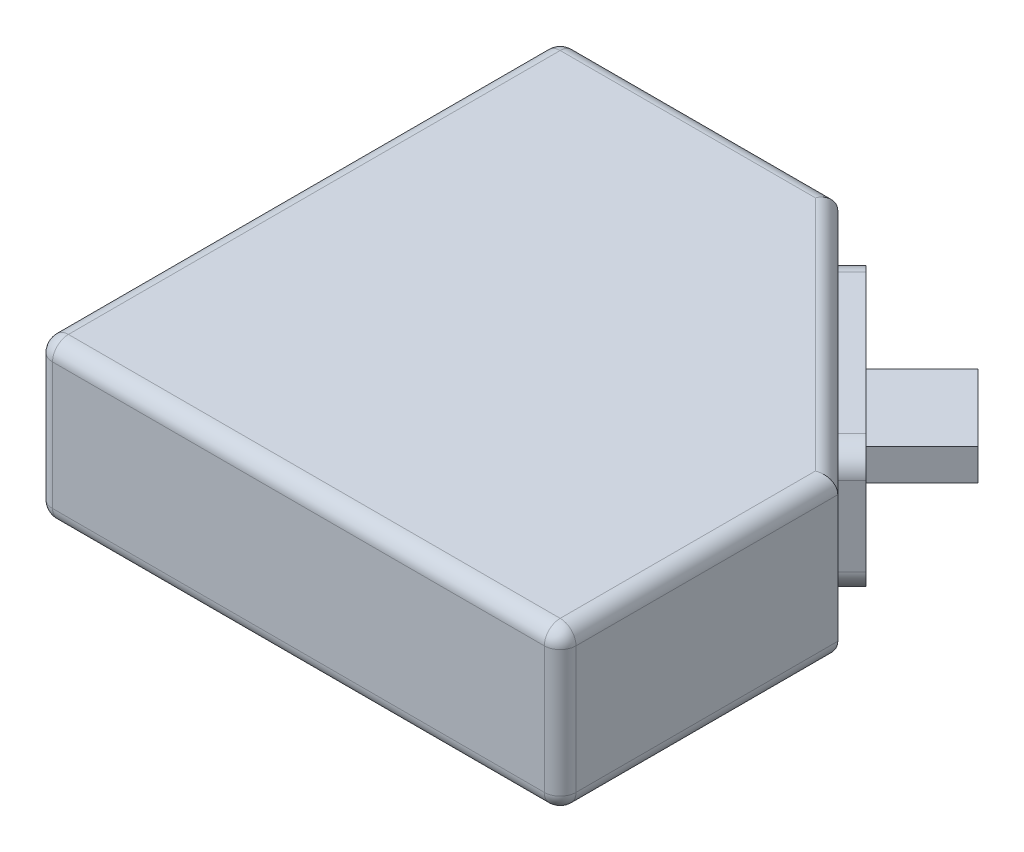
ISO-10303-21;
HEADER;
FILE_DESCRIPTION(('STEP AP214'),'2;1');
FILE_NAME('part.step','',(''),(''),'','','');
FILE_SCHEMA(('AUTOMOTIVE_DESIGN { 1 0 10303 214 1 1 1 1 }'));
ENDSEC;
DATA;
#1=APPLICATION_CONTEXT('core data for automotive mechanical design processes');
#2=APPLICATION_PROTOCOL_DEFINITION('international standard','automotive_design',2000,#1);
#3=PRODUCT_CONTEXT('',#1,'mechanical');
#4=PRODUCT('Part','Part','',(#3));
#5=PRODUCT_RELATED_PRODUCT_CATEGORY('part','',(#4));
#6=PRODUCT_DEFINITION_FORMATION('','',#4);
#7=PRODUCT_DEFINITION_CONTEXT('part definition',#1,'design');
#8=PRODUCT_DEFINITION('design','',#6,#7);
#9=PRODUCT_DEFINITION_SHAPE('','',#8);
#10=(LENGTH_UNIT() NAMED_UNIT(*) SI_UNIT(.MILLI.,.METRE.));
#11=(NAMED_UNIT(*) PLANE_ANGLE_UNIT() SI_UNIT($,.RADIAN.));
#12=(NAMED_UNIT(*) SI_UNIT($,.STERADIAN.) SOLID_ANGLE_UNIT());
#13=UNCERTAINTY_MEASURE_WITH_UNIT(LENGTH_MEASURE(1.E-05),#10,'distance_accuracy_value','');
#14=(GEOMETRIC_REPRESENTATION_CONTEXT(3) GLOBAL_UNCERTAINTY_ASSIGNED_CONTEXT((#13)) GLOBAL_UNIT_ASSIGNED_CONTEXT((#10,
#11,#12)) REPRESENTATION_CONTEXT('',''));
#15=CARTESIAN_POINT('',(0.,0.,0.));
#16=DIRECTION('',(0.,0.,1.));
#17=DIRECTION('',(1.,0.,0.));
#18=AXIS2_PLACEMENT_3D('',#15,#16,#17);
#19=CARTESIAN_POINT('',(35.,20.,-66.));
#20=DIRECTION('',(-0.707106781186548,0.,0.707106781186548));
#21=DIRECTION('',(0.707106781186548,0.,0.707106781186548));
#22=AXIS2_PLACEMENT_3D('',#19,#20,#21);
#23=PLANE('',#22);
#24=DIRECTION('',(0.,-1.,0.));
#25=VECTOR('',#24,1.);
#26=CARTESIAN_POINT('',(66.,20.,-35.));
#27=LINE('',#26,#25);
#28=CARTESIAN_POINT('',(66.,18.,-35.));
#29=VERTEX_POINT('',#28);
#30=CARTESIAN_POINT('',(66.,2.,-35.));
#31=VERTEX_POINT('',#30);
#32=EDGE_CURVE('E299',#29,#31,#27,.T.);
#33=ORIENTED_EDGE('',*,*,#32,.T.);
#34=DIRECTION('',(-0.707106781186548,0.,-0.707106781186548));
#35=VECTOR('',#34,1.);
#36=CARTESIAN_POINT('',(35.,2.,-66.));
#37=LINE('',#36,#35);
#38=CARTESIAN_POINT('',(59.3388347648318,1.99999999999999,-41.6611652351682));
#39=VERTEX_POINT('',#38);
#40=EDGE_CURVE('E335',#31,#39,#37,.T.);
#41=ORIENTED_EDGE('',*,*,#40,.T.);
#42=CARTESIAN_POINT('',(59.3388347648319,5.,-41.6611652351682));
#43=DIRECTION('',(0.707106781186548,0.,-0.707106781186547));
#44=DIRECTION('',(-0.707106781186547,0.,-0.707106781186548));
#45=AXIS2_PLACEMENT_3D('',#42,#43,#44);
#46=CIRCLE('',#45,3.);
#47=CARTESIAN_POINT('',(61.4601551083915,5.00000000000002,-39.5398448916085));
#48=VERTEX_POINT('',#47);
#49=EDGE_CURVE('E226',#48,#39,#46,.T.);
#50=ORIENTED_EDGE('',*,*,#49,.F.);
#51=DIRECTION('',(0.,-1.,0.));
#52=VECTOR('',#51,1.);
#53=CARTESIAN_POINT('',(61.4601551083915,15.,-39.5398448916085));
#54=LINE('',#53,#52);
#55=CARTESIAN_POINT('',(61.4601551083915,15.,-39.5398448916085));
#56=VERTEX_POINT('',#55);
#57=EDGE_CURVE('E239',#56,#48,#54,.T.);
#58=ORIENTED_EDGE('',*,*,#57,.F.);
#59=CARTESIAN_POINT('',(59.3388347648319,15.,-41.6611652351682));
#60=DIRECTION('',(0.707106781186548,0.,-0.707106781186547));
#61=DIRECTION('',(0.707106781186547,0.,0.707106781186548));
#62=AXIS2_PLACEMENT_3D('',#59,#60,#61);
#63=CIRCLE('',#62,3.);
#64=CARTESIAN_POINT('',(59.3388347648318,18.,-41.6611652351682));
#65=VERTEX_POINT('',#64);
#66=EDGE_CURVE('E268',#65,#56,#63,.T.);
#67=ORIENTED_EDGE('',*,*,#66,.F.);
#68=DIRECTION('',(-0.707106781186548,0.,-0.707106781186548));
#69=VECTOR('',#68,1.);
#70=CARTESIAN_POINT('',(35.,18.,-66.));
#71=LINE('',#70,#69);
#72=EDGE_CURVE('E329',#65,#29,#71,.F.);
#73=ORIENTED_EDGE('',*,*,#72,.T.);
#74=EDGE_LOOP('',(#33,#41,#50,#58,#67,#73));
#75=FACE_BOUND('',#74,.T.);
#76=ADVANCED_FACE('F35',(#75),#23,.F.);
#77=CARTESIAN_POINT('',(61.1066017177982,5.,-43.4289321881345));
#78=DIRECTION('',(0.707106781186548,0.,-0.707106781186547));
#79=DIRECTION('',(-0.707106781186547,0.,-0.707106781186548));
#80=AXIS2_PLACEMENT_3D('',#77,#78,#79);
#81=PLANE('',#80);
#82=CARTESIAN_POINT('',(61.1066017177982,5.,-43.4289321881345));
#83=DIRECTION('',(0.707106781186548,0.,-0.707106781186547));
#84=DIRECTION('',(-0.707106781186547,0.,-0.707106781186548));
#85=AXIS2_PLACEMENT_3D('',#82,#83,#84);
#86=CIRCLE('',#85,3.);
#87=CARTESIAN_POINT('',(63.2279220613579,5.00000000000002,-41.3076118445749));
#88=VERTEX_POINT('',#87);
#89=CARTESIAN_POINT('',(61.1066017177982,2.,-43.4289321881346));
#90=VERTEX_POINT('',#89);
#91=EDGE_CURVE('E235',#88,#90,#86,.T.);
#92=ORIENTED_EDGE('',*,*,#91,.T.);
#93=DIRECTION('',(-0.707106781186547,0.,-0.707106781186547));
#94=VECTOR('',#93,1.);
#95=CARTESIAN_POINT('',(43.4289321881346,2.,-61.1066017177982));
#96=LINE('',#95,#94);
#97=CARTESIAN_POINT('',(43.4289321881346,2.,-61.1066017177982));
#98=VERTEX_POINT('',#97);
#99=EDGE_CURVE('E238',#90,#98,#96,.T.);
#100=ORIENTED_EDGE('',*,*,#99,.T.);
#101=CARTESIAN_POINT('',(43.4289321881346,5.,-61.1066017177982));
#102=DIRECTION('',(0.707106781186548,0.,-0.707106781186547));
#103=DIRECTION('',(0.707106781186547,0.,0.707106781186548));
#104=AXIS2_PLACEMENT_3D('',#101,#102,#103);
#105=CIRCLE('',#104,3.);
#106=CARTESIAN_POINT('',(41.3076118445749,5.00000000000002,-63.2279220613579));
#107=VERTEX_POINT('',#106);
#108=EDGE_CURVE('E241',#98,#107,#105,.T.);
#109=ORIENTED_EDGE('',*,*,#108,.T.);
#110=DIRECTION('',(0.,1.,0.));
#111=VECTOR('',#110,1.);
#112=CARTESIAN_POINT('',(41.3076118445749,15.,-63.2279220613579));
#113=LINE('',#112,#111);
#114=CARTESIAN_POINT('',(41.3076118445749,15.,-63.2279220613579));
#115=VERTEX_POINT('',#114);
#116=EDGE_CURVE('E243',#107,#115,#113,.T.);
#117=ORIENTED_EDGE('',*,*,#116,.T.);
#118=CARTESIAN_POINT('',(43.4289321881346,15.,-61.1066017177982));
#119=DIRECTION('',(0.707106781186548,0.,-0.707106781186547));
#120=DIRECTION('',(0.707106781186547,0.,0.707106781186548));
#121=AXIS2_PLACEMENT_3D('',#118,#119,#120);
#122=CIRCLE('',#121,3.);
#123=CARTESIAN_POINT('',(43.4289321881346,18.,-61.1066017177982));
#124=VERTEX_POINT('',#123);
#125=EDGE_CURVE('E245',#115,#124,#122,.T.);
#126=ORIENTED_EDGE('',*,*,#125,.T.);
#127=DIRECTION('',(0.707106781186547,0.,0.707106781186547));
#128=VECTOR('',#127,1.);
#129=CARTESIAN_POINT('',(43.4289321881346,18.,-61.1066017177982));
#130=LINE('',#129,#128);
#131=CARTESIAN_POINT('',(61.1066017177982,18.,-43.4289321881346));
#132=VERTEX_POINT('',#131);
#133=EDGE_CURVE('E247',#124,#132,#130,.T.);
#134=ORIENTED_EDGE('',*,*,#133,.T.);
#135=CARTESIAN_POINT('',(61.1066017177982,15.,-43.4289321881345));
#136=DIRECTION('',(0.707106781186548,0.,-0.707106781186547));
#137=DIRECTION('',(0.707106781186547,0.,0.707106781186548));
#138=AXIS2_PLACEMENT_3D('',#135,#136,#137);
#139=CIRCLE('',#138,3.);
#140=CARTESIAN_POINT('',(63.2279220613579,15.,-41.3076118445749));
#141=VERTEX_POINT('',#140);
#142=EDGE_CURVE('E249',#132,#141,#139,.T.);
#143=ORIENTED_EDGE('',*,*,#142,.T.);
#144=DIRECTION('',(0.,-1.,0.));
#145=VECTOR('',#144,1.);
#146=CARTESIAN_POINT('',(63.2279220613579,15.,-41.3076118445749));
#147=LINE('',#146,#145);
#148=EDGE_CURVE('E251',#141,#88,#147,.T.);
#149=ORIENTED_EDGE('',*,*,#148,.T.);
#150=EDGE_LOOP('',(#92,#100,#109,#117,#126,#134,#143,#149));
#151=FACE_BOUND('',#150,.T.);
#152=DIRECTION('',(-0.707106781186548,0.,-0.707106781186548));
#153=VECTOR('',#152,1.);
#154=CARTESIAN_POINT('',(48.0251262658471,7.99999999999999,-56.5104076400857));
#155=LINE('',#154,#153);
#156=CARTESIAN_POINT('',(56.5104076400857,8.,-48.0251262658471));
#157=VERTEX_POINT('',#156);
#158=CARTESIAN_POINT('',(48.0251262658471,7.99999999999999,-56.5104076400857));
#159=VERTEX_POINT('',#158);
#160=EDGE_CURVE('E423',#157,#159,#155,.T.);
#161=ORIENTED_EDGE('',*,*,#160,.F.);
#162=DIRECTION('',(0.,-1.,0.));
#163=VECTOR('',#162,1.);
#164=CARTESIAN_POINT('',(56.5104076400857,12.,-48.0251262658471));
#165=LINE('',#164,#163);
#166=CARTESIAN_POINT('',(56.5104076400857,12.,-48.0251262658471));
#167=VERTEX_POINT('',#166);
#168=EDGE_CURVE('E224',#167,#157,#165,.T.);
#169=ORIENTED_EDGE('',*,*,#168,.F.);
#170=DIRECTION('',(0.707106781186548,0.,0.707106781186548));
#171=VECTOR('',#170,1.);
#172=CARTESIAN_POINT('',(48.0251262658471,12.,-56.5104076400857));
#173=LINE('',#172,#171);
#174=CARTESIAN_POINT('',(48.0251262658471,12.,-56.5104076400857));
#175=VERTEX_POINT('',#174);
#176=EDGE_CURVE('E220',#175,#167,#173,.T.);
#177=ORIENTED_EDGE('',*,*,#176,.F.);
#178=DIRECTION('',(0.,1.,0.));
#179=VECTOR('',#178,1.);
#180=CARTESIAN_POINT('',(48.0251262658471,12.,-56.5104076400857));
#181=LINE('',#180,#179);
#182=EDGE_CURVE('E425',#159,#175,#181,.T.);
#183=ORIENTED_EDGE('',*,*,#182,.F.);
#184=EDGE_LOOP('',(#161,#169,#177,#183));
#185=FACE_BOUND('',#184,.T.);
#186=ADVANCED_FACE('F442',(#151,#185),#81,.T.);
#187=CARTESIAN_POINT('',(41.6611652351682,5.,-59.3388347648319));
#188=DIRECTION('',(0.707106781186548,0.,-0.707106781186547));
#189=DIRECTION('',(0.707106781186547,0.,0.707106781186548));
#190=AXIS2_PLACEMENT_3D('',#187,#188,#189);
#191=CIRCLE('',#190,3.);
#192=CARTESIAN_POINT('',(41.6611652351682,2.,-59.3388347648318));
#193=VERTEX_POINT('',#192);
#194=CARTESIAN_POINT('',(39.5398448916085,5.00000000000002,-61.4601551083915));
#195=VERTEX_POINT('',#194);
#196=EDGE_CURVE('E256',#193,#195,#191,.T.);
#197=ORIENTED_EDGE('',*,*,#196,.F.);
#198=DIRECTION('',(-0.707106781186548,0.,-0.707106781186548));
#199=VECTOR('',#198,1.);
#200=CARTESIAN_POINT('',(35.,2.,-66.));
#201=LINE('',#200,#199);
#202=CARTESIAN_POINT('',(35.,2.,-66.));
#203=VERTEX_POINT('',#202);
#204=EDGE_CURVE('E333',#193,#203,#201,.T.);
#205=ORIENTED_EDGE('',*,*,#204,.T.);
#206=DIRECTION('',(0.,-1.,0.));
#207=VECTOR('',#206,1.);
#208=CARTESIAN_POINT('',(35.,20.,-66.));
#209=LINE('',#208,#207);
#210=CARTESIAN_POINT('',(35.,18.,-66.));
#211=VERTEX_POINT('',#210);
#212=EDGE_CURVE('E296',#211,#203,#209,.T.);
#213=ORIENTED_EDGE('',*,*,#212,.F.);
#214=DIRECTION('',(-0.707106781186548,0.,-0.707106781186548));
#215=VECTOR('',#214,1.);
#216=CARTESIAN_POINT('',(35.,18.,-66.));
#217=LINE('',#216,#215);
#218=CARTESIAN_POINT('',(41.6611652351682,18.,-59.3388347648318));
#219=VERTEX_POINT('',#218);
#220=EDGE_CURVE('E331',#211,#219,#217,.F.);
#221=ORIENTED_EDGE('',*,*,#220,.T.);
#222=CARTESIAN_POINT('',(41.6611652351682,15.,-59.3388347648319));
#223=DIRECTION('',(0.707106781186548,0.,-0.707106781186547));
#224=DIRECTION('',(0.707106781186547,0.,0.707106781186548));
#225=AXIS2_PLACEMENT_3D('',#222,#223,#224);
#226=CIRCLE('',#225,3.);
#227=CARTESIAN_POINT('',(39.5398448916085,15.,-61.4601551083915));
#228=VERTEX_POINT('',#227);
#229=EDGE_CURVE('E262',#228,#219,#226,.T.);
#230=ORIENTED_EDGE('',*,*,#229,.F.);
#231=DIRECTION('',(0.,1.,0.));
#232=VECTOR('',#231,1.);
#233=CARTESIAN_POINT('',(39.5398448916085,15.,-61.4601551083915));
#234=LINE('',#233,#232);
#235=EDGE_CURVE('E259',#195,#228,#234,.T.);
#236=ORIENTED_EDGE('',*,*,#235,.F.);
#237=EDGE_LOOP('',(#197,#205,#213,#221,#230,#236));
#238=FACE_BOUND('',#237,.T.);
#239=ADVANCED_FACE('F444',(#238),#23,.F.);
#240=CARTESIAN_POINT('',(0.,20.,0.));
#241=DIRECTION('',(1.,0.,0.));
#242=DIRECTION('',(0.,0.,-1.));
#243=AXIS2_PLACEMENT_3D('',#240,#241,#242);
#244=PLANE('',#243);
#245=DIRECTION('',(0.,0.,1.));
#246=VECTOR('',#245,1.);
#247=CARTESIAN_POINT('',(0.,18.,0.));
#248=LINE('',#247,#246);
#249=CARTESIAN_POINT('',(0.,18.,-2.));
#250=VERTEX_POINT('',#249);
#251=CARTESIAN_POINT('',(0.,18.,-64.));
#252=VERTEX_POINT('',#251);
#253=EDGE_CURVE('E345',#250,#252,#248,.F.);
#254=ORIENTED_EDGE('',*,*,#253,.T.);
#255=DIRECTION('',(0.,-1.,0.));
#256=VECTOR('',#255,1.);
#257=CARTESIAN_POINT('',(0.,20.,-64.));
#258=LINE('',#257,#256);
#259=CARTESIAN_POINT('',(0.,2.,-64.));
#260=VERTEX_POINT('',#259);
#261=EDGE_CURVE('E350',#252,#260,#258,.T.);
#262=ORIENTED_EDGE('',*,*,#261,.T.);
#263=DIRECTION('',(0.,0.,1.));
#264=VECTOR('',#263,1.);
#265=CARTESIAN_POINT('',(0.,2.,0.));
#266=LINE('',#265,#264);
#267=CARTESIAN_POINT('',(0.,2.,-2.));
#268=VERTEX_POINT('',#267);
#269=EDGE_CURVE('E347',#260,#268,#266,.T.);
#270=ORIENTED_EDGE('',*,*,#269,.T.);
#271=DIRECTION('',(0.,-1.,0.));
#272=VECTOR('',#271,1.);
#273=CARTESIAN_POINT('',(0.,20.,-2.));
#274=LINE('',#273,#272);
#275=EDGE_CURVE('E343',#268,#250,#274,.F.);
#276=ORIENTED_EDGE('',*,*,#275,.T.);
#277=EDGE_LOOP('',(#254,#262,#270,#276));
#278=FACE_BOUND('',#277,.T.);
#279=ADVANCED_FACE('F451',(#278),#244,.F.);
#280=CARTESIAN_POINT('',(0.,20.,0.));
#281=DIRECTION('',(0.,0.,-1.));
#282=DIRECTION('',(-1.,0.,0.));
#283=AXIS2_PLACEMENT_3D('',#280,#281,#282);
#284=PLANE('',#283);
#285=DIRECTION('',(1.,0.,0.));
#286=VECTOR('',#285,1.);
#287=CARTESIAN_POINT('',(66.,2.,0.));
#288=LINE('',#287,#286);
#289=CARTESIAN_POINT('',(2.,2.,0.));
#290=VERTEX_POINT('',#289);
#291=CARTESIAN_POINT('',(64.,2.,0.));
#292=VERTEX_POINT('',#291);
#293=EDGE_CURVE('E306',#290,#292,#288,.T.);
#294=ORIENTED_EDGE('',*,*,#293,.T.);
#295=DIRECTION('',(0.,-1.,0.));
#296=VECTOR('',#295,1.);
#297=CARTESIAN_POINT('',(64.,20.,0.));
#298=LINE('',#297,#296);
#299=CARTESIAN_POINT('',(64.,18.,0.));
#300=VERTEX_POINT('',#299);
#301=EDGE_CURVE('E309',#292,#300,#298,.F.);
#302=ORIENTED_EDGE('',*,*,#301,.T.);
#303=DIRECTION('',(1.,0.,0.));
#304=VECTOR('',#303,1.);
#305=CARTESIAN_POINT('',(0.,18.,0.));
#306=LINE('',#305,#304);
#307=CARTESIAN_POINT('',(2.,18.,0.));
#308=VERTEX_POINT('',#307);
#309=EDGE_CURVE('E304',#300,#308,#306,.F.);
#310=ORIENTED_EDGE('',*,*,#309,.T.);
#311=DIRECTION('',(0.,-1.,0.));
#312=VECTOR('',#311,1.);
#313=CARTESIAN_POINT('',(2.,20.,0.));
#314=LINE('',#313,#312);
#315=EDGE_CURVE('E302',#308,#290,#314,.T.);
#316=ORIENTED_EDGE('',*,*,#315,.T.);
#317=EDGE_LOOP('',(#294,#302,#310,#316));
#318=FACE_BOUND('',#317,.T.);
#319=ADVANCED_FACE('F504',(#318),#284,.F.);
#320=CARTESIAN_POINT('',(66.,20.,0.));
#321=DIRECTION('',(-1.,0.,0.));
#322=DIRECTION('',(0.,0.,1.));
#323=AXIS2_PLACEMENT_3D('',#320,#321,#322);
#324=PLANE('',#323);
#325=DIRECTION('',(0.,-1.,0.));
#326=VECTOR('',#325,1.);
#327=CARTESIAN_POINT('',(66.,20.,-2.));
#328=LINE('',#327,#326);
#329=CARTESIAN_POINT('',(66.,18.,-2.));
#330=VERTEX_POINT('',#329);
#331=CARTESIAN_POINT('',(66.,2.,-2.));
#332=VERTEX_POINT('',#331);
#333=EDGE_CURVE('E322',#330,#332,#328,.T.);
#334=ORIENTED_EDGE('',*,*,#333,.T.);
#335=DIRECTION('',(0.,0.,-1.));
#336=VECTOR('',#335,1.);
#337=CARTESIAN_POINT('',(66.,2.,-35.));
#338=LINE('',#337,#336);
#339=EDGE_CURVE('E326',#332,#31,#338,.T.);
#340=ORIENTED_EDGE('',*,*,#339,.T.);
#341=ORIENTED_EDGE('',*,*,#32,.F.);
#342=DIRECTION('',(0.,0.,-1.));
#343=VECTOR('',#342,1.);
#344=CARTESIAN_POINT('',(66.,18.,0.));
#345=LINE('',#344,#343);
#346=EDGE_CURVE('E324',#29,#330,#345,.F.);
#347=ORIENTED_EDGE('',*,*,#346,.T.);
#348=EDGE_LOOP('',(#334,#340,#341,#347));
#349=FACE_BOUND('',#348,.T.);
#350=ADVANCED_FACE('F499',(#349),#324,.F.);
#351=CARTESIAN_POINT('',(0.,20.,-66.));
#352=DIRECTION('',(0.,0.,1.));
#353=DIRECTION('',(1.,0.,0.));
#354=AXIS2_PLACEMENT_3D('',#351,#352,#353);
#355=PLANE('',#354);
#356=ORIENTED_EDGE('',*,*,#212,.T.);
#357=DIRECTION('',(-1.,0.,0.));
#358=VECTOR('',#357,1.);
#359=CARTESIAN_POINT('',(0.,2.,-66.));
#360=LINE('',#359,#358);
#361=CARTESIAN_POINT('',(2.,2.,-66.));
#362=VERTEX_POINT('',#361);
#363=EDGE_CURVE('E341',#203,#362,#360,.T.);
#364=ORIENTED_EDGE('',*,*,#363,.T.);
#365=DIRECTION('',(0.,-1.,0.));
#366=VECTOR('',#365,1.);
#367=CARTESIAN_POINT('',(2.,20.,-66.));
#368=LINE('',#367,#366);
#369=CARTESIAN_POINT('',(2.,18.,-66.));
#370=VERTEX_POINT('',#369);
#371=EDGE_CURVE('E337',#362,#370,#368,.F.);
#372=ORIENTED_EDGE('',*,*,#371,.T.);
#373=DIRECTION('',(-1.,0.,0.));
#374=VECTOR('',#373,1.);
#375=CARTESIAN_POINT('',(0.,18.,-66.));
#376=LINE('',#375,#374);
#377=EDGE_CURVE('E339',#370,#211,#376,.F.);
#378=ORIENTED_EDGE('',*,*,#377,.T.);
#379=EDGE_LOOP('',(#356,#364,#372,#378));
#380=FACE_BOUND('',#379,.T.);
#381=ADVANCED_FACE('F494',(#380),#355,.F.);
#382=CARTESIAN_POINT('',(0.,20.,0.));
#383=DIRECTION('',(0.,-1.,0.));
#384=DIRECTION('',(0.,0.,-1.));
#385=AXIS2_PLACEMENT_3D('',#382,#383,#384);
#386=PLANE('',#385);
#387=DIRECTION('',(-0.707106781186548,0.,-0.707106781186548));
#388=VECTOR('',#387,1.);
#389=CARTESIAN_POINT('',(49.0857864376269,20.,-49.0857864376269));
#390=LINE('',#389,#388);
#391=CARTESIAN_POINT('',(64.,20.,-34.1715728752538));
#392=VERTEX_POINT('',#391);
#393=CARTESIAN_POINT('',(34.1715728752538,20.,-64.));
#394=VERTEX_POINT('',#393);
#395=EDGE_CURVE('E44',#392,#394,#390,.T.);
#396=ORIENTED_EDGE('',*,*,#395,.T.);
#397=DIRECTION('',(-1.,0.,0.));
#398=VECTOR('',#397,1.);
#399=CARTESIAN_POINT('',(0.,20.,-64.));
#400=LINE('',#399,#398);
#401=CARTESIAN_POINT('',(2.,20.,-64.));
#402=VERTEX_POINT('',#401);
#403=EDGE_CURVE('E11',#394,#402,#400,.T.);
#404=ORIENTED_EDGE('',*,*,#403,.T.);
#405=DIRECTION('',(0.,0.,1.));
#406=VECTOR('',#405,1.);
#407=CARTESIAN_POINT('',(2.,20.,0.));
#408=LINE('',#407,#406);
#409=CARTESIAN_POINT('',(2.,20.,-2.));
#410=VERTEX_POINT('',#409);
#411=EDGE_CURVE('E352',#402,#410,#408,.T.);
#412=ORIENTED_EDGE('',*,*,#411,.T.);
#413=DIRECTION('',(1.,0.,0.));
#414=VECTOR('',#413,1.);
#415=CARTESIAN_POINT('',(0.,20.,-2.));
#416=LINE('',#415,#414);
#417=CARTESIAN_POINT('',(64.,20.,-2.));
#418=VERTEX_POINT('',#417);
#419=EDGE_CURVE('E354',#410,#418,#416,.T.);
#420=ORIENTED_EDGE('',*,*,#419,.T.);
#421=DIRECTION('',(0.,0.,-1.));
#422=VECTOR('',#421,1.);
#423=CARTESIAN_POINT('',(64.,20.,0.));
#424=LINE('',#423,#422);
#425=EDGE_CURVE('E55',#418,#392,#424,.T.);
#426=ORIENTED_EDGE('',*,*,#425,.T.);
#427=EDGE_LOOP('',(#396,#404,#412,#420,#426));
#428=FACE_BOUND('',#427,.T.);
#429=ADVANCED_FACE('F491',(#428),#386,.F.);
#430=CARTESIAN_POINT('',(0.,0.,0.));
#431=DIRECTION('',(0.,-1.,0.));
#432=DIRECTION('',(0.,0.,-1.));
#433=AXIS2_PLACEMENT_3D('',#430,#431,#432);
#434=PLANE('',#433);
#435=DIRECTION('',(0.,0.,-1.));
#436=VECTOR('',#435,1.);
#437=CARTESIAN_POINT('',(64.,0.,0.));
#438=LINE('',#437,#436);
#439=CARTESIAN_POINT('',(64.,0.,-34.1715728752538));
#440=VERTEX_POINT('',#439);
#441=CARTESIAN_POINT('',(64.,0.,-2.));
#442=VERTEX_POINT('',#441);
#443=EDGE_CURVE('E317',#440,#442,#438,.F.);
#444=ORIENTED_EDGE('',*,*,#443,.T.);
#445=DIRECTION('',(1.,0.,0.));
#446=VECTOR('',#445,1.);
#447=CARTESIAN_POINT('',(0.,0.,-2.));
#448=LINE('',#447,#446);
#449=CARTESIAN_POINT('',(2.,0.,-2.));
#450=VERTEX_POINT('',#449);
#451=EDGE_CURVE('E319',#442,#450,#448,.F.);
#452=ORIENTED_EDGE('',*,*,#451,.T.);
#453=DIRECTION('',(0.,0.,1.));
#454=VECTOR('',#453,1.);
#455=CARTESIAN_POINT('',(2.,0.,-66.));
#456=LINE('',#455,#454);
#457=CARTESIAN_POINT('',(2.,0.,-64.));
#458=VERTEX_POINT('',#457);
#459=EDGE_CURVE('E311',#450,#458,#456,.F.);
#460=ORIENTED_EDGE('',*,*,#459,.T.);
#461=DIRECTION('',(-1.,0.,0.));
#462=VECTOR('',#461,1.);
#463=CARTESIAN_POINT('',(35.,0.,-64.));
#464=LINE('',#463,#462);
#465=CARTESIAN_POINT('',(34.1715728752538,0.,-64.));
#466=VERTEX_POINT('',#465);
#467=EDGE_CURVE('E313',#458,#466,#464,.F.);
#468=ORIENTED_EDGE('',*,*,#467,.T.);
#469=DIRECTION('',(-0.707106781186548,0.,-0.707106781186548));
#470=VECTOR('',#469,1.);
#471=CARTESIAN_POINT('',(64.5857864376269,0.,-33.5857864376269));
#472=LINE('',#471,#470);
#473=EDGE_CURVE('E315',#466,#440,#472,.F.);
#474=ORIENTED_EDGE('',*,*,#473,.T.);
#475=EDGE_LOOP('',(#444,#452,#460,#468,#474));
#476=FACE_BOUND('',#475,.T.);
#477=ADVANCED_FACE('F489',(#476),#434,.T.);
#478=CARTESIAN_POINT('',(61.1066017177982,5.,-43.4289321881345));
#479=DIRECTION('',(-0.707106781186548,0.,0.707106781186547));
#480=DIRECTION('',(0.707106781186547,0.,0.707106781186548));
#481=AXIS2_PLACEMENT_3D('',#478,#479,#480);
#482=CYLINDRICAL_SURFACE('',#481,3.);
#483=ORIENTED_EDGE('',*,*,#49,.T.);
#484=DIRECTION('',(-0.707106781186548,0.,0.707106781186547));
#485=VECTOR('',#484,1.);
#486=CARTESIAN_POINT('',(61.1066017177982,2.,-43.4289321881346));
#487=LINE('',#486,#485);
#488=EDGE_CURVE('E293',#90,#39,#487,.T.);
#489=ORIENTED_EDGE('',*,*,#488,.F.);
#490=ORIENTED_EDGE('',*,*,#91,.F.);
#491=DIRECTION('',(-0.707106781186548,0.,0.707106781186547));
#492=VECTOR('',#491,1.);
#493=CARTESIAN_POINT('',(63.2279220613579,5.00000000000002,-41.3076118445749));
#494=LINE('',#493,#492);
#495=EDGE_CURVE('E252',#88,#48,#494,.T.);
#496=ORIENTED_EDGE('',*,*,#495,.T.);
#497=EDGE_LOOP('',(#483,#489,#490,#496));
#498=FACE_BOUND('',#497,.T.);
#499=ADVANCED_FACE('F485',(#498),#482,.T.);
#500=CARTESIAN_POINT('',(43.4289321881346,2.,-61.1066017177982));
#501=DIRECTION('',(0.,1.,0.));
#502=DIRECTION('',(0.,0.,1.));
#503=AXIS2_PLACEMENT_3D('',#500,#501,#502);
#504=PLANE('',#503);
#505=DIRECTION('',(-0.707106781186547,0.,-0.707106781186547));
#506=VECTOR('',#505,1.);
#507=CARTESIAN_POINT('',(41.6611652351682,2.,-59.3388347648318));
#508=LINE('',#507,#506);
#509=EDGE_CURVE('E229',#39,#193,#508,.T.);
#510=ORIENTED_EDGE('',*,*,#509,.T.);
#511=DIRECTION('',(-0.707106781186548,0.,0.707106781186547));
#512=VECTOR('',#511,1.);
#513=CARTESIAN_POINT('',(43.4289321881346,2.,-61.1066017177982));
#514=LINE('',#513,#512);
#515=EDGE_CURVE('E290',#98,#193,#514,.T.);
#516=ORIENTED_EDGE('',*,*,#515,.F.);
#517=ORIENTED_EDGE('',*,*,#99,.F.);
#518=ORIENTED_EDGE('',*,*,#488,.T.);
#519=EDGE_LOOP('',(#510,#516,#517,#518));
#520=FACE_BOUND('',#519,.T.);
#521=ADVANCED_FACE('F481',(#520),#504,.F.);
#522=CARTESIAN_POINT('',(43.4289321881346,5.,-61.1066017177982));
#523=DIRECTION('',(-0.707106781186548,0.,0.707106781186547));
#524=DIRECTION('',(0.707106781186547,0.,0.707106781186548));
#525=AXIS2_PLACEMENT_3D('',#522,#523,#524);
#526=CYLINDRICAL_SURFACE('',#525,3.);
#527=ORIENTED_EDGE('',*,*,#196,.T.);
#528=DIRECTION('',(-0.707106781186548,0.,0.707106781186547));
#529=VECTOR('',#528,1.);
#530=CARTESIAN_POINT('',(41.3076118445749,5.00000000000002,-63.2279220613579));
#531=LINE('',#530,#529);
#532=EDGE_CURVE('E287',#107,#195,#531,.T.);
#533=ORIENTED_EDGE('',*,*,#532,.F.);
#534=ORIENTED_EDGE('',*,*,#108,.F.);
#535=ORIENTED_EDGE('',*,*,#515,.T.);
#536=EDGE_LOOP('',(#527,#533,#534,#535));
#537=FACE_BOUND('',#536,.T.);
#538=ADVANCED_FACE('F477',(#537),#526,.T.);
#539=CARTESIAN_POINT('',(41.3076118445749,15.,-63.2279220613579));
#540=DIRECTION('',(0.707106781186547,0.,0.707106781186548));
#541=DIRECTION('',(0.707106781186548,0.,-0.707106781186547));
#542=AXIS2_PLACEMENT_3D('',#539,#540,#541);
#543=PLANE('',#542);
#544=ORIENTED_EDGE('',*,*,#235,.T.);
#545=DIRECTION('',(-0.707106781186548,0.,0.707106781186547));
#546=VECTOR('',#545,1.);
#547=CARTESIAN_POINT('',(41.3076118445749,15.,-63.2279220613579));
#548=LINE('',#547,#546);
#549=EDGE_CURVE('E284',#115,#228,#548,.T.);
#550=ORIENTED_EDGE('',*,*,#549,.F.);
#551=ORIENTED_EDGE('',*,*,#116,.F.);
#552=ORIENTED_EDGE('',*,*,#532,.T.);
#553=EDGE_LOOP('',(#544,#550,#551,#552));
#554=FACE_BOUND('',#553,.T.);
#555=ADVANCED_FACE('F473',(#554),#543,.F.);
#556=CARTESIAN_POINT('',(43.4289321881346,15.,-61.1066017177982));
#557=DIRECTION('',(-0.707106781186548,0.,0.707106781186547));
#558=DIRECTION('',(0.707106781186547,0.,0.707106781186548));
#559=AXIS2_PLACEMENT_3D('',#556,#557,#558);
#560=CYLINDRICAL_SURFACE('',#559,3.);
#561=ORIENTED_EDGE('',*,*,#229,.T.);
#562=DIRECTION('',(-0.707106781186548,0.,0.707106781186547));
#563=VECTOR('',#562,1.);
#564=CARTESIAN_POINT('',(43.4289321881346,18.,-61.1066017177982));
#565=LINE('',#564,#563);
#566=EDGE_CURVE('E281',#124,#219,#565,.T.);
#567=ORIENTED_EDGE('',*,*,#566,.F.);
#568=ORIENTED_EDGE('',*,*,#125,.F.);
#569=ORIENTED_EDGE('',*,*,#549,.T.);
#570=EDGE_LOOP('',(#561,#567,#568,#569));
#571=FACE_BOUND('',#570,.T.);
#572=ADVANCED_FACE('F469',(#571),#560,.T.);
#573=CARTESIAN_POINT('',(43.4289321881346,18.,-61.1066017177982));
#574=DIRECTION('',(0.,-1.,0.));
#575=DIRECTION('',(0.,0.,-1.));
#576=AXIS2_PLACEMENT_3D('',#573,#574,#575);
#577=PLANE('',#576);
#578=DIRECTION('',(0.707106781186547,0.,0.707106781186547));
#579=VECTOR('',#578,1.);
#580=CARTESIAN_POINT('',(41.6611652351682,18.,-59.3388347648318));
#581=LINE('',#580,#579);
#582=EDGE_CURVE('E265',#219,#65,#581,.T.);
#583=ORIENTED_EDGE('',*,*,#582,.T.);
#584=DIRECTION('',(-0.707106781186548,0.,0.707106781186547));
#585=VECTOR('',#584,1.);
#586=CARTESIAN_POINT('',(61.1066017177982,18.,-43.4289321881346));
#587=LINE('',#586,#585);
#588=EDGE_CURVE('E278',#132,#65,#587,.T.);
#589=ORIENTED_EDGE('',*,*,#588,.F.);
#590=ORIENTED_EDGE('',*,*,#133,.F.);
#591=ORIENTED_EDGE('',*,*,#566,.T.);
#592=EDGE_LOOP('',(#583,#589,#590,#591));
#593=FACE_BOUND('',#592,.T.);
#594=ADVANCED_FACE('F465',(#593),#577,.F.);
#595=CARTESIAN_POINT('',(61.1066017177982,15.,-43.4289321881345));
#596=DIRECTION('',(-0.707106781186548,0.,0.707106781186547));
#597=DIRECTION('',(0.707106781186547,0.,0.707106781186548));
#598=AXIS2_PLACEMENT_3D('',#595,#596,#597);
#599=CYLINDRICAL_SURFACE('',#598,3.);
#600=ORIENTED_EDGE('',*,*,#66,.T.);
#601=DIRECTION('',(-0.707106781186548,0.,0.707106781186547));
#602=VECTOR('',#601,1.);
#603=CARTESIAN_POINT('',(63.2279220613579,15.,-41.3076118445749));
#604=LINE('',#603,#602);
#605=EDGE_CURVE('E275',#141,#56,#604,.T.);
#606=ORIENTED_EDGE('',*,*,#605,.F.);
#607=ORIENTED_EDGE('',*,*,#142,.F.);
#608=ORIENTED_EDGE('',*,*,#588,.T.);
#609=EDGE_LOOP('',(#600,#606,#607,#608));
#610=FACE_BOUND('',#609,.T.);
#611=ADVANCED_FACE('F461',(#610),#599,.T.);
#612=CARTESIAN_POINT('',(63.2279220613579,15.,-41.3076118445749));
#613=DIRECTION('',(-0.707106781186547,0.,-0.707106781186548));
#614=DIRECTION('',(-0.707106781186548,0.,0.707106781186547));
#615=AXIS2_PLACEMENT_3D('',#612,#613,#614);
#616=PLANE('',#615);
#617=ORIENTED_EDGE('',*,*,#57,.T.);
#618=ORIENTED_EDGE('',*,*,#495,.F.);
#619=ORIENTED_EDGE('',*,*,#148,.F.);
#620=ORIENTED_EDGE('',*,*,#605,.T.);
#621=EDGE_LOOP('',(#617,#618,#619,#620));
#622=FACE_BOUND('',#621,.T.);
#623=ADVANCED_FACE('F458',(#622),#616,.F.);
#624=CARTESIAN_POINT('',(63.5814754519512,12.,-55.0961940777126));
#625=DIRECTION('',(-0.707106781186548,0.,-0.707106781186548));
#626=DIRECTION('',(-0.707106781186548,0.,0.707106781186548));
#627=AXIS2_PLACEMENT_3D('',#624,#625,#626);
#628=PLANE('',#627);
#629=ORIENTED_EDGE('',*,*,#168,.T.);
#630=DIRECTION('',(-0.707106781186548,0.,0.707106781186548));
#631=VECTOR('',#630,1.);
#632=CARTESIAN_POINT('',(63.5814754519512,8.,-55.0961940777126));
#633=LINE('',#632,#631);
#634=CARTESIAN_POINT('',(63.5814754519512,8.,-55.0961940777126));
#635=VERTEX_POINT('',#634);
#636=EDGE_CURVE('E204',#635,#157,#633,.T.);
#637=ORIENTED_EDGE('',*,*,#636,.F.);
#638=DIRECTION('',(0.,-1.,0.));
#639=VECTOR('',#638,1.);
#640=CARTESIAN_POINT('',(63.5814754519512,12.,-55.0961940777126));
#641=LINE('',#640,#639);
#642=CARTESIAN_POINT('',(63.5814754519512,12.,-55.0961940777126));
#643=VERTEX_POINT('',#642);
#644=EDGE_CURVE('E211',#643,#635,#641,.T.);
#645=ORIENTED_EDGE('',*,*,#644,.F.);
#646=DIRECTION('',(-0.707106781186548,0.,0.707106781186548));
#647=VECTOR('',#646,1.);
#648=CARTESIAN_POINT('',(63.5814754519512,12.,-55.0961940777126));
#649=LINE('',#648,#647);
#650=EDGE_CURVE('E433',#643,#167,#649,.T.);
#651=ORIENTED_EDGE('',*,*,#650,.T.);
#652=EDGE_LOOP('',(#629,#637,#645,#651));
#653=FACE_BOUND('',#652,.T.);
#654=ADVANCED_FACE('F222',(#653),#628,.F.);
#655=CARTESIAN_POINT('',(55.0961940777126,7.99999999999999,-63.5814754519512));
#656=DIRECTION('',(0.,1.,0.));
#657=DIRECTION('',(0.,0.,1.));
#658=AXIS2_PLACEMENT_3D('',#655,#656,#657);
#659=PLANE('',#658);
#660=ORIENTED_EDGE('',*,*,#160,.T.);
#661=DIRECTION('',(-0.707106781186548,0.,0.707106781186548));
#662=VECTOR('',#661,1.);
#663=CARTESIAN_POINT('',(55.0961940777126,7.99999999999999,-63.5814754519512));
#664=LINE('',#663,#662);
#665=CARTESIAN_POINT('',(55.0961940777126,7.99999999999999,-63.5814754519512));
#666=VERTEX_POINT('',#665);
#667=EDGE_CURVE('E207',#666,#159,#664,.T.);
#668=ORIENTED_EDGE('',*,*,#667,.F.);
#669=DIRECTION('',(-0.707106781186548,0.,-0.707106781186548));
#670=VECTOR('',#669,1.);
#671=CARTESIAN_POINT('',(55.0961940777126,7.99999999999999,-63.5814754519512));
#672=LINE('',#671,#670);
#673=EDGE_CURVE('E200',#635,#666,#672,.T.);
#674=ORIENTED_EDGE('',*,*,#673,.F.);
#675=ORIENTED_EDGE('',*,*,#636,.T.);
#676=EDGE_LOOP('',(#660,#668,#674,#675));
#677=FACE_BOUND('',#676,.T.);
#678=ADVANCED_FACE('F202',(#677),#659,.F.);
#679=CARTESIAN_POINT('',(55.0961940777126,12.,-63.5814754519512));
#680=DIRECTION('',(0.707106781186548,0.,0.707106781186548));
#681=DIRECTION('',(0.707106781186548,0.,-0.707106781186548));
#682=AXIS2_PLACEMENT_3D('',#679,#680,#681);
#683=PLANE('',#682);
#684=ORIENTED_EDGE('',*,*,#182,.T.);
#685=DIRECTION('',(-0.707106781186548,0.,0.707106781186548));
#686=VECTOR('',#685,1.);
#687=CARTESIAN_POINT('',(55.0961940777126,12.,-63.5814754519512));
#688=LINE('',#687,#686);
#689=CARTESIAN_POINT('',(55.0961940777126,12.,-63.5814754519512));
#690=VERTEX_POINT('',#689);
#691=EDGE_CURVE('E231',#690,#175,#688,.T.);
#692=ORIENTED_EDGE('',*,*,#691,.F.);
#693=DIRECTION('',(0.,1.,0.));
#694=VECTOR('',#693,1.);
#695=CARTESIAN_POINT('',(55.0961940777126,12.,-63.5814754519512));
#696=LINE('',#695,#694);
#697=EDGE_CURVE('E210',#666,#690,#696,.T.);
#698=ORIENTED_EDGE('',*,*,#697,.F.);
#699=ORIENTED_EDGE('',*,*,#667,.T.);
#700=EDGE_LOOP('',(#684,#692,#698,#699));
#701=FACE_BOUND('',#700,.T.);
#702=ADVANCED_FACE('F440',(#701),#683,.F.);
#703=CARTESIAN_POINT('',(55.0961940777126,12.,-63.5814754519512));
#704=DIRECTION('',(0.,-1.,0.));
#705=DIRECTION('',(0.,0.,-1.));
#706=AXIS2_PLACEMENT_3D('',#703,#704,#705);
#707=PLANE('',#706);
#708=ORIENTED_EDGE('',*,*,#176,.T.);
#709=ORIENTED_EDGE('',*,*,#650,.F.);
#710=DIRECTION('',(0.707106781186548,0.,0.707106781186548));
#711=VECTOR('',#710,1.);
#712=CARTESIAN_POINT('',(55.0961940777126,12.,-63.5814754519512));
#713=LINE('',#712,#711);
#714=EDGE_CURVE('E216',#690,#643,#713,.T.);
#715=ORIENTED_EDGE('',*,*,#714,.F.);
#716=ORIENTED_EDGE('',*,*,#691,.T.);
#717=EDGE_LOOP('',(#708,#709,#715,#716));
#718=FACE_BOUND('',#717,.T.);
#719=ADVANCED_FACE('F436',(#718),#707,.F.);
#720=CARTESIAN_POINT('',(59.3388347648319,0.,-59.3388347648319));
#721=DIRECTION('',(-0.707106781186548,0.,0.707106781186548));
#722=DIRECTION('',(0.707106781186548,0.,0.707106781186548));
#723=AXIS2_PLACEMENT_3D('',#720,#721,#722);
#724=PLANE('',#723);
#725=ORIENTED_EDGE('',*,*,#644,.T.);
#726=ORIENTED_EDGE('',*,*,#673,.T.);
#727=ORIENTED_EDGE('',*,*,#697,.T.);
#728=ORIENTED_EDGE('',*,*,#714,.T.);
#729=EDGE_LOOP('',(#725,#726,#727,#728));
#730=FACE_BOUND('',#729,.T.);
#731=ADVANCED_FACE('F214',(#730),#724,.F.);
#732=CARTESIAN_POINT('',(0.,18.,-64.));
#733=DIRECTION('',(-1.,0.,0.));
#734=DIRECTION('',(0.,0.,1.));
#735=AXIS2_PLACEMENT_3D('',#732,#733,#734);
#736=CYLINDRICAL_SURFACE('',#735,2.);
#737=CARTESIAN_POINT('',(2.,18.,-64.));
#738=DIRECTION('',(-1.,0.,0.));
#739=DIRECTION('',(0.,0.,1.));
#740=AXIS2_PLACEMENT_3D('',#737,#738,#739);
#741=CIRCLE('',#740,2.);
#742=EDGE_CURVE('E39',#402,#370,#741,.T.);
#743=ORIENTED_EDGE('',*,*,#742,.F.);
#744=ORIENTED_EDGE('',*,*,#403,.F.);
#745=CARTESIAN_POINT('',(34.1715728752538,18.,-64.));
#746=DIRECTION('',(-0.923879532511287,0.,-0.38268343236509));
#747=DIRECTION('',(0.38268343236509,0.,-0.923879532511287));
#748=AXIS2_PLACEMENT_3D('',#745,#746,#747);
#749=ELLIPSE('',#748,2.16478440058479,2.);
#750=EDGE_CURVE('E413',#211,#394,#749,.F.);
#751=ORIENTED_EDGE('',*,*,#750,.F.);
#752=ORIENTED_EDGE('',*,*,#377,.F.);
#753=EDGE_LOOP('',(#743,#744,#751,#752));
#754=FACE_BOUND('',#753,.T.);
#755=ADVANCED_FACE('F37',(#754),#736,.T.);
#756=CARTESIAN_POINT('',(2.,18.,-64.));
#757=DIRECTION('',(0.,0.,1.));
#758=DIRECTION('',(1.,0.,0.));
#759=AXIS2_PLACEMENT_3D('',#756,#757,#758);
#760=SPHERICAL_SURFACE('',#759,2.);
#761=CARTESIAN_POINT('',(2.,18.,-64.));
#762=DIRECTION('',(0.,0.,-1.));
#763=DIRECTION('',(-1.,0.,0.));
#764=AXIS2_PLACEMENT_3D('',#761,#762,#763);
#765=CIRCLE('',#764,2.);
#766=EDGE_CURVE('E408',#402,#252,#765,.F.);
#767=ORIENTED_EDGE('',*,*,#766,.F.);
#768=ORIENTED_EDGE('',*,*,#742,.T.);
#769=CARTESIAN_POINT('',(2.,18.,-64.));
#770=DIRECTION('',(0.,1.,0.));
#771=DIRECTION('',(0.,0.,1.));
#772=AXIS2_PLACEMENT_3D('',#769,#770,#771);
#773=CIRCLE('',#772,2.);
#774=EDGE_CURVE('E411',#252,#370,#773,.F.);
#775=ORIENTED_EDGE('',*,*,#774,.F.);
#776=EDGE_LOOP('',(#767,#768,#775));
#777=FACE_BOUND('',#776,.T.);
#778=ADVANCED_FACE('F578',(#777),#760,.T.);
#779=CARTESIAN_POINT('',(49.0857864376269,18.,-49.0857864376269));
#780=DIRECTION('',(-0.707106781186548,0.,-0.707106781186548));
#781=DIRECTION('',(-0.707106781186548,0.,0.707106781186548));
#782=AXIS2_PLACEMENT_3D('',#779,#780,#781);
#783=CYLINDRICAL_SURFACE('',#782,2.);
#784=ORIENTED_EDGE('',*,*,#750,.T.);
#785=ORIENTED_EDGE('',*,*,#395,.F.);
#786=CARTESIAN_POINT('',(64.,18.,-34.1715728752538));
#787=DIRECTION('',(-0.38268343236509,0.,-0.923879532511287));
#788=DIRECTION('',(0.923879532511287,0.,-0.38268343236509));
#789=AXIS2_PLACEMENT_3D('',#786,#787,#788);
#790=ELLIPSE('',#789,2.16478440058479,2.);
#791=EDGE_CURVE('E405',#29,#392,#790,.F.);
#792=ORIENTED_EDGE('',*,*,#791,.F.);
#793=ORIENTED_EDGE('',*,*,#72,.F.);
#794=ORIENTED_EDGE('',*,*,#582,.F.);
#795=ORIENTED_EDGE('',*,*,#220,.F.);
#796=EDGE_LOOP('',(#784,#785,#792,#793,#794,#795));
#797=FACE_BOUND('',#796,.T.);
#798=ADVANCED_FACE('F575',(#797),#783,.T.);
#799=CARTESIAN_POINT('',(2.,20.,-64.));
#800=DIRECTION('',(0.,-1.,0.));
#801=DIRECTION('',(0.,0.,-1.));
#802=AXIS2_PLACEMENT_3D('',#799,#800,#801);
#803=CYLINDRICAL_SURFACE('',#802,2.);
#804=ORIENTED_EDGE('',*,*,#774,.T.);
#805=ORIENTED_EDGE('',*,*,#371,.F.);
#806=CARTESIAN_POINT('',(2.,2.,-64.));
#807=DIRECTION('',(0.,-1.,0.));
#808=DIRECTION('',(0.,0.,-1.));
#809=AXIS2_PLACEMENT_3D('',#806,#807,#808);
#810=CIRCLE('',#809,2.);
#811=EDGE_CURVE('E399',#260,#362,#810,.T.);
#812=ORIENTED_EDGE('',*,*,#811,.F.);
#813=ORIENTED_EDGE('',*,*,#261,.F.);
#814=EDGE_LOOP('',(#804,#805,#812,#813));
#815=FACE_BOUND('',#814,.T.);
#816=ADVANCED_FACE('F571',(#815),#803,.T.);
#817=CARTESIAN_POINT('',(2.,18.,0.));
#818=DIRECTION('',(0.,0.,1.));
#819=DIRECTION('',(1.,0.,0.));
#820=AXIS2_PLACEMENT_3D('',#817,#818,#819);
#821=CYLINDRICAL_SURFACE('',#820,2.);
#822=ORIENTED_EDGE('',*,*,#766,.T.);
#823=ORIENTED_EDGE('',*,*,#253,.F.);
#824=CARTESIAN_POINT('',(2.,18.,-2.));
#825=DIRECTION('',(0.,0.,1.));
#826=DIRECTION('',(1.,0.,0.));
#827=AXIS2_PLACEMENT_3D('',#824,#825,#826);
#828=CIRCLE('',#827,2.);
#829=EDGE_CURVE('E396',#410,#250,#828,.T.);
#830=ORIENTED_EDGE('',*,*,#829,.F.);
#831=ORIENTED_EDGE('',*,*,#411,.F.);
#832=EDGE_LOOP('',(#822,#823,#830,#831));
#833=FACE_BOUND('',#832,.T.);
#834=ADVANCED_FACE('F567',(#833),#821,.T.);
#835=CARTESIAN_POINT('',(0.,18.,-2.));
#836=DIRECTION('',(1.,0.,0.));
#837=DIRECTION('',(0.,0.,-1.));
#838=AXIS2_PLACEMENT_3D('',#835,#836,#837);
#839=CYLINDRICAL_SURFACE('',#838,2.);
#840=CARTESIAN_POINT('',(64.,18.,-2.));
#841=DIRECTION('',(1.,0.,0.));
#842=DIRECTION('',(0.,0.,-1.));
#843=AXIS2_PLACEMENT_3D('',#840,#841,#842);
#844=CIRCLE('',#843,2.);
#845=EDGE_CURVE('E390',#418,#300,#844,.T.);
#846=ORIENTED_EDGE('',*,*,#845,.F.);
#847=ORIENTED_EDGE('',*,*,#419,.F.);
#848=CARTESIAN_POINT('',(2.,18.,-2.));
#849=DIRECTION('',(-1.,0.,0.));
#850=DIRECTION('',(0.,0.,1.));
#851=AXIS2_PLACEMENT_3D('',#848,#849,#850);
#852=CIRCLE('',#851,2.);
#853=EDGE_CURVE('E393',#308,#410,#852,.T.);
#854=ORIENTED_EDGE('',*,*,#853,.F.);
#855=ORIENTED_EDGE('',*,*,#309,.F.);
#856=EDGE_LOOP('',(#846,#847,#854,#855));
#857=FACE_BOUND('',#856,.T.);
#858=ADVANCED_FACE('F563',(#857),#839,.T.);
#859=CARTESIAN_POINT('',(64.,18.,0.));
#860=DIRECTION('',(0.,0.,-1.));
#861=DIRECTION('',(-1.,0.,0.));
#862=AXIS2_PLACEMENT_3D('',#859,#860,#861);
#863=CYLINDRICAL_SURFACE('',#862,2.);
#864=ORIENTED_EDGE('',*,*,#791,.T.);
#865=ORIENTED_EDGE('',*,*,#425,.F.);
#866=CARTESIAN_POINT('',(64.,18.,-2.));
#867=DIRECTION('',(0.,0.,1.));
#868=DIRECTION('',(1.,0.,0.));
#869=AXIS2_PLACEMENT_3D('',#866,#867,#868);
#870=CIRCLE('',#869,2.);
#871=EDGE_CURVE('E387',#330,#418,#870,.T.);
#872=ORIENTED_EDGE('',*,*,#871,.F.);
#873=ORIENTED_EDGE('',*,*,#346,.F.);
#874=EDGE_LOOP('',(#864,#865,#872,#873));
#875=FACE_BOUND('',#874,.T.);
#876=ADVANCED_FACE('F559',(#875),#863,.T.);
#877=CARTESIAN_POINT('',(0.,2.,-64.));
#878=DIRECTION('',(1.,0.,0.));
#879=DIRECTION('',(0.,0.,-1.));
#880=AXIS2_PLACEMENT_3D('',#877,#878,#879);
#881=CYLINDRICAL_SURFACE('',#880,2.);
#882=CARTESIAN_POINT('',(2.,2.,-64.));
#883=DIRECTION('',(-1.,0.,0.));
#884=DIRECTION('',(0.,0.,1.));
#885=AXIS2_PLACEMENT_3D('',#882,#883,#884);
#886=CIRCLE('',#885,2.);
#887=EDGE_CURVE('E402',#362,#458,#886,.T.);
#888=ORIENTED_EDGE('',*,*,#887,.F.);
#889=ORIENTED_EDGE('',*,*,#363,.F.);
#890=CARTESIAN_POINT('',(34.1715728752538,2.,-64.));
#891=DIRECTION('',(0.923879532511287,0.,0.38268343236509));
#892=DIRECTION('',(0.38268343236509,0.,-0.923879532511287));
#893=AXIS2_PLACEMENT_3D('',#890,#891,#892);
#894=ELLIPSE('',#893,2.16478440058479,2.);
#895=EDGE_CURVE('E384',#466,#203,#894,.T.);
#896=ORIENTED_EDGE('',*,*,#895,.F.);
#897=ORIENTED_EDGE('',*,*,#467,.F.);
#898=EDGE_LOOP('',(#888,#889,#896,#897));
#899=FACE_BOUND('',#898,.T.);
#900=ADVANCED_FACE('F555',(#899),#881,.T.);
#901=CARTESIAN_POINT('',(2.,2.,-64.));
#902=DIRECTION('',(0.,0.,1.));
#903=DIRECTION('',(1.,0.,0.));
#904=AXIS2_PLACEMENT_3D('',#901,#902,#903);
#905=SPHERICAL_SURFACE('',#904,2.);
#906=ORIENTED_EDGE('',*,*,#811,.T.);
#907=ORIENTED_EDGE('',*,*,#887,.T.);
#908=CARTESIAN_POINT('',(2.,2.,-64.));
#909=DIRECTION('',(0.,0.,-1.));
#910=DIRECTION('',(-1.,0.,0.));
#911=AXIS2_PLACEMENT_3D('',#908,#909,#910);
#912=CIRCLE('',#911,2.);
#913=EDGE_CURVE('E381',#260,#458,#912,.F.);
#914=ORIENTED_EDGE('',*,*,#913,.F.);
#915=EDGE_LOOP('',(#906,#907,#914));
#916=FACE_BOUND('',#915,.T.);
#917=ADVANCED_FACE('F551',(#916),#905,.T.);
#918=CARTESIAN_POINT('',(2.,18.,-2.));
#919=DIRECTION('',(0.,0.,1.));
#920=DIRECTION('',(1.,0.,0.));
#921=AXIS2_PLACEMENT_3D('',#918,#919,#920);
#922=SPHERICAL_SURFACE('',#921,2.);
#923=ORIENTED_EDGE('',*,*,#853,.T.);
#924=ORIENTED_EDGE('',*,*,#829,.T.);
#925=CARTESIAN_POINT('',(2.,18.,-2.));
#926=DIRECTION('',(0.,1.,0.));
#927=DIRECTION('',(0.,0.,1.));
#928=AXIS2_PLACEMENT_3D('',#925,#926,#927);
#929=CIRCLE('',#928,2.);
#930=EDGE_CURVE('E378',#308,#250,#929,.F.);
#931=ORIENTED_EDGE('',*,*,#930,.F.);
#932=EDGE_LOOP('',(#923,#924,#931));
#933=FACE_BOUND('',#932,.T.);
#934=ADVANCED_FACE('F547',(#933),#922,.T.);
#935=CARTESIAN_POINT('',(64.,18.,-2.));
#936=DIRECTION('',(0.,0.,1.));
#937=DIRECTION('',(1.,0.,0.));
#938=AXIS2_PLACEMENT_3D('',#935,#936,#937);
#939=SPHERICAL_SURFACE('',#938,2.);
#940=ORIENTED_EDGE('',*,*,#871,.T.);
#941=ORIENTED_EDGE('',*,*,#845,.T.);
#942=CARTESIAN_POINT('',(64.,18.,-2.));
#943=DIRECTION('',(0.,1.,0.));
#944=DIRECTION('',(0.,0.,1.));
#945=AXIS2_PLACEMENT_3D('',#942,#943,#944);
#946=CIRCLE('',#945,2.);
#947=EDGE_CURVE('E375',#330,#300,#946,.F.);
#948=ORIENTED_EDGE('',*,*,#947,.F.);
#949=EDGE_LOOP('',(#940,#941,#948));
#950=FACE_BOUND('',#949,.T.);
#951=ADVANCED_FACE('F543',(#950),#939,.T.);
#952=CARTESIAN_POINT('',(33.5857864376269,2.,-64.5857864376269));
#953=DIRECTION('',(0.707106781186548,0.,0.707106781186548));
#954=DIRECTION('',(0.707106781186548,0.,-0.707106781186548));
#955=AXIS2_PLACEMENT_3D('',#952,#953,#954);
#956=CYLINDRICAL_SURFACE('',#955,2.);
#957=ORIENTED_EDGE('',*,*,#509,.F.);
#958=ORIENTED_EDGE('',*,*,#40,.F.);
#959=CARTESIAN_POINT('',(64.,2.,-34.1715728752538));
#960=DIRECTION('',(0.38268343236509,0.,0.923879532511287));
#961=DIRECTION('',(0.923879532511287,0.,-0.38268343236509));
#962=AXIS2_PLACEMENT_3D('',#959,#960,#961);
#963=ELLIPSE('',#962,2.16478440058479,2.);
#964=EDGE_CURVE('E373',#440,#31,#963,.T.);
#965=ORIENTED_EDGE('',*,*,#964,.F.);
#966=ORIENTED_EDGE('',*,*,#473,.F.);
#967=ORIENTED_EDGE('',*,*,#895,.T.);
#968=ORIENTED_EDGE('',*,*,#204,.F.);
#969=EDGE_LOOP('',(#957,#958,#965,#966,#967,#968));
#970=FACE_BOUND('',#969,.T.);
#971=ADVANCED_FACE('F539',(#970),#956,.T.);
#972=CARTESIAN_POINT('',(2.,2.,0.));
#973=DIRECTION('',(0.,0.,-1.));
#974=DIRECTION('',(-1.,0.,0.));
#975=AXIS2_PLACEMENT_3D('',#972,#973,#974);
#976=CYLINDRICAL_SURFACE('',#975,2.);
#977=ORIENTED_EDGE('',*,*,#913,.T.);
#978=ORIENTED_EDGE('',*,*,#459,.F.);
#979=CARTESIAN_POINT('',(2.,2.,-2.));
#980=DIRECTION('',(0.,0.,1.));
#981=DIRECTION('',(1.,0.,0.));
#982=AXIS2_PLACEMENT_3D('',#979,#980,#981);
#983=CIRCLE('',#982,2.);
#984=EDGE_CURVE('E370',#268,#450,#983,.T.);
#985=ORIENTED_EDGE('',*,*,#984,.F.);
#986=ORIENTED_EDGE('',*,*,#269,.F.);
#987=EDGE_LOOP('',(#977,#978,#985,#986));
#988=FACE_BOUND('',#987,.T.);
#989=ADVANCED_FACE('F535',(#988),#976,.T.);
#990=CARTESIAN_POINT('',(2.,20.,-2.));
#991=DIRECTION('',(0.,-1.,0.));
#992=DIRECTION('',(0.,0.,-1.));
#993=AXIS2_PLACEMENT_3D('',#990,#991,#992);
#994=CYLINDRICAL_SURFACE('',#993,2.);
#995=ORIENTED_EDGE('',*,*,#930,.T.);
#996=ORIENTED_EDGE('',*,*,#275,.F.);
#997=CARTESIAN_POINT('',(2.,2.,-2.));
#998=DIRECTION('',(0.,-1.,0.));
#999=DIRECTION('',(0.,0.,-1.));
#1000=AXIS2_PLACEMENT_3D('',#997,#998,#999);
#1001=CIRCLE('',#1000,2.);
#1002=EDGE_CURVE('E368',#290,#268,#1001,.T.);
#1003=ORIENTED_EDGE('',*,*,#1002,.F.);
#1004=ORIENTED_EDGE('',*,*,#315,.F.);
#1005=EDGE_LOOP('',(#995,#996,#1003,#1004));
#1006=FACE_BOUND('',#1005,.T.);
#1007=ADVANCED_FACE('F531',(#1006),#994,.T.);
#1008=CARTESIAN_POINT('',(64.,20.,-2.));
#1009=DIRECTION('',(0.,-1.,0.));
#1010=DIRECTION('',(0.,0.,-1.));
#1011=AXIS2_PLACEMENT_3D('',#1008,#1009,#1010);
#1012=CYLINDRICAL_SURFACE('',#1011,2.);
#1013=ORIENTED_EDGE('',*,*,#947,.T.);
#1014=ORIENTED_EDGE('',*,*,#301,.F.);
#1015=CARTESIAN_POINT('',(64.,2.,-2.));
#1016=DIRECTION('',(0.,-1.,0.));
#1017=DIRECTION('',(0.,0.,-1.));
#1018=AXIS2_PLACEMENT_3D('',#1015,#1016,#1017);
#1019=CIRCLE('',#1018,2.);
#1020=EDGE_CURVE('E365',#332,#292,#1019,.T.);
#1021=ORIENTED_EDGE('',*,*,#1020,.F.);
#1022=ORIENTED_EDGE('',*,*,#333,.F.);
#1023=EDGE_LOOP('',(#1013,#1014,#1021,#1022));
#1024=FACE_BOUND('',#1023,.T.);
#1025=ADVANCED_FACE('F527',(#1024),#1012,.T.);
#1026=CARTESIAN_POINT('',(64.,2.,0.));
#1027=DIRECTION('',(0.,0.,1.));
#1028=DIRECTION('',(1.,0.,0.));
#1029=AXIS2_PLACEMENT_3D('',#1026,#1027,#1028);
#1030=CYLINDRICAL_SURFACE('',#1029,2.);
#1031=ORIENTED_EDGE('',*,*,#964,.T.);
#1032=ORIENTED_EDGE('',*,*,#339,.F.);
#1033=CARTESIAN_POINT('',(64.,2.,-2.));
#1034=DIRECTION('',(0.,0.,1.));
#1035=DIRECTION('',(1.,0.,0.));
#1036=AXIS2_PLACEMENT_3D('',#1033,#1034,#1035);
#1037=CIRCLE('',#1036,2.);
#1038=EDGE_CURVE('E362',#442,#332,#1037,.T.);
#1039=ORIENTED_EDGE('',*,*,#1038,.F.);
#1040=ORIENTED_EDGE('',*,*,#443,.F.);
#1041=EDGE_LOOP('',(#1031,#1032,#1039,#1040));
#1042=FACE_BOUND('',#1041,.T.);
#1043=ADVANCED_FACE('F523',(#1042),#1030,.T.);
#1044=CARTESIAN_POINT('',(2.,2.,-2.));
#1045=DIRECTION('',(0.,0.,1.));
#1046=DIRECTION('',(1.,0.,0.));
#1047=AXIS2_PLACEMENT_3D('',#1044,#1045,#1046);
#1048=SPHERICAL_SURFACE('',#1047,2.);
#1049=ORIENTED_EDGE('',*,*,#1002,.T.);
#1050=ORIENTED_EDGE('',*,*,#984,.T.);
#1051=CARTESIAN_POINT('',(2.,2.,-2.));
#1052=DIRECTION('',(-1.,0.,0.));
#1053=DIRECTION('',(0.,0.,1.));
#1054=AXIS2_PLACEMENT_3D('',#1051,#1052,#1053);
#1055=CIRCLE('',#1054,2.);
#1056=EDGE_CURVE('E360',#290,#450,#1055,.F.);
#1057=ORIENTED_EDGE('',*,*,#1056,.F.);
#1058=EDGE_LOOP('',(#1049,#1050,#1057));
#1059=FACE_BOUND('',#1058,.T.);
#1060=ADVANCED_FACE('F519',(#1059),#1048,.T.);
#1061=CARTESIAN_POINT('',(64.,2.,-2.));
#1062=DIRECTION('',(0.,0.,1.));
#1063=DIRECTION('',(1.,0.,0.));
#1064=AXIS2_PLACEMENT_3D('',#1061,#1062,#1063);
#1065=SPHERICAL_SURFACE('',#1064,2.);
#1066=ORIENTED_EDGE('',*,*,#1038,.T.);
#1067=ORIENTED_EDGE('',*,*,#1020,.T.);
#1068=CARTESIAN_POINT('',(64.,2.,-2.));
#1069=DIRECTION('',(1.,0.,0.));
#1070=DIRECTION('',(0.,0.,-1.));
#1071=AXIS2_PLACEMENT_3D('',#1068,#1069,#1070);
#1072=CIRCLE('',#1071,2.);
#1073=EDGE_CURVE('E358',#442,#292,#1072,.F.);
#1074=ORIENTED_EDGE('',*,*,#1073,.F.);
#1075=EDGE_LOOP('',(#1066,#1067,#1074));
#1076=FACE_BOUND('',#1075,.T.);
#1077=ADVANCED_FACE('F515',(#1076),#1065,.T.);
#1078=CARTESIAN_POINT('',(0.,2.,-2.));
#1079=DIRECTION('',(-1.,0.,0.));
#1080=DIRECTION('',(0.,0.,1.));
#1081=AXIS2_PLACEMENT_3D('',#1078,#1079,#1080);
#1082=CYLINDRICAL_SURFACE('',#1081,2.);
#1083=ORIENTED_EDGE('',*,*,#1056,.T.);
#1084=ORIENTED_EDGE('',*,*,#451,.F.);
#1085=ORIENTED_EDGE('',*,*,#1073,.T.);
#1086=ORIENTED_EDGE('',*,*,#293,.F.);
#1087=EDGE_LOOP('',(#1083,#1084,#1085,#1086));
#1088=FACE_BOUND('',#1087,.T.);
#1089=ADVANCED_FACE('F512',(#1088),#1082,.T.);
#1090=CLOSED_SHELL('',(#76,#186,#239,#279,#319,#350,#381,#429,#477,#499,#521,#538,#555,#572,
#594,#611,#623,#654,#678,#702,#719,#731,#755,#778,#798,#816,#834,#858,#876,#900,#917,#934,#951,
#971,#989,#1007,#1025,#1043,#1060,#1077,#1089));
#1091=MANIFOLD_SOLID_BREP('B2',#1090);
#1092=ADVANCED_BREP_SHAPE_REPRESENTATION('',(#18,#1091),#14);
#1093=SHAPE_DEFINITION_REPRESENTATION(#9,#1092);
ENDSEC;
END-ISO-10303-21;
